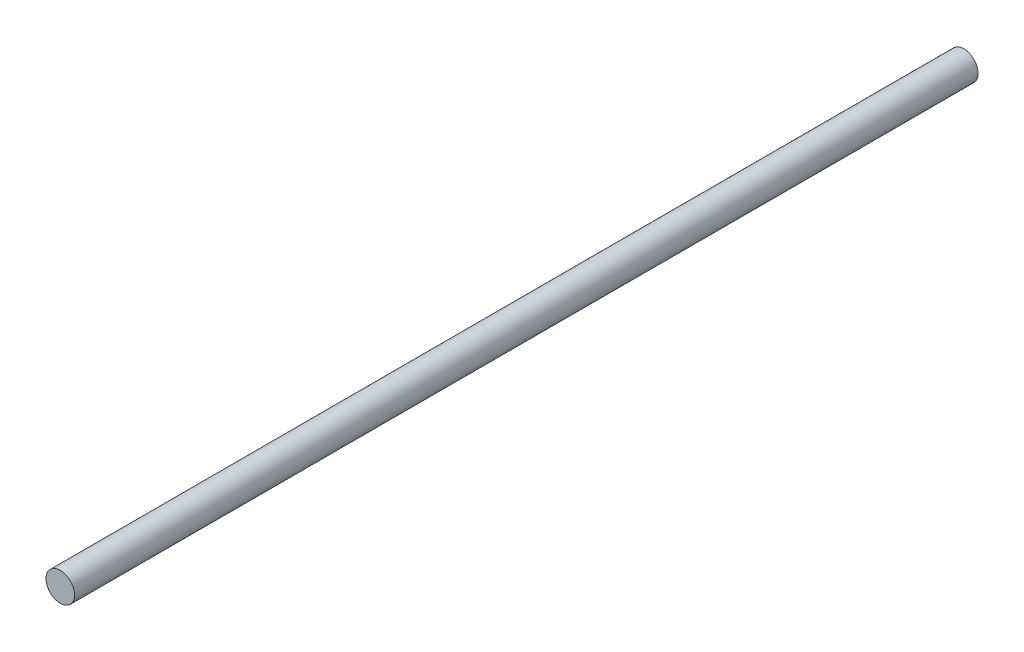
ISO-10303-21;
HEADER;
FILE_DESCRIPTION(('STEP AP214'),'2;1');
FILE_NAME('part.step','',(''),(''),'','','');
FILE_SCHEMA(('AUTOMOTIVE_DESIGN { 1 0 10303 214 1 1 1 1 }'));
ENDSEC;
DATA;
#1=APPLICATION_CONTEXT('core data for automotive mechanical design processes');
#2=APPLICATION_PROTOCOL_DEFINITION('international standard','automotive_design',2000,#1);
#3=PRODUCT_CONTEXT('',#1,'mechanical');
#4=PRODUCT('Part','Part','',(#3));
#5=PRODUCT_RELATED_PRODUCT_CATEGORY('part','',(#4));
#6=PRODUCT_DEFINITION_FORMATION('','',#4);
#7=PRODUCT_DEFINITION_CONTEXT('part definition',#1,'design');
#8=PRODUCT_DEFINITION('design','',#6,#7);
#9=PRODUCT_DEFINITION_SHAPE('','',#8);
#10=(LENGTH_UNIT() NAMED_UNIT(*) SI_UNIT(.MILLI.,.METRE.));
#11=(NAMED_UNIT(*) PLANE_ANGLE_UNIT() SI_UNIT($,.RADIAN.));
#12=(NAMED_UNIT(*) SI_UNIT($,.STERADIAN.) SOLID_ANGLE_UNIT());
#13=UNCERTAINTY_MEASURE_WITH_UNIT(LENGTH_MEASURE(1.E-05),#10,'distance_accuracy_value','');
#14=(GEOMETRIC_REPRESENTATION_CONTEXT(3) GLOBAL_UNCERTAINTY_ASSIGNED_CONTEXT((#13)) GLOBAL_UNIT_ASSIGNED_CONTEXT((#10,
#11,#12)) REPRESENTATION_CONTEXT('',''));
#15=CARTESIAN_POINT('',(0.,0.,0.));
#16=DIRECTION('',(0.,0.,1.));
#17=DIRECTION('',(1.,0.,0.));
#18=AXIS2_PLACEMENT_3D('',#15,#16,#17);
#19=CARTESIAN_POINT('',(0.,0.,241.3));
#20=DIRECTION('',(0.,0.,-1.));
#21=DIRECTION('',(-1.,0.,0.));
#22=AXIS2_PLACEMENT_3D('',#19,#20,#21);
#23=CYLINDRICAL_SURFACE('',#22,3.81);
#24=CARTESIAN_POINT('',(0.,0.,241.3));
#25=DIRECTION('',(0.,0.,1.));
#26=DIRECTION('',(1.,0.,0.));
#27=AXIS2_PLACEMENT_3D('',#24,#25,#26);
#28=CIRCLE('',#27,3.81);
#29=CARTESIAN_POINT('',(-3.81,0.,241.3));
#30=VERTEX_POINT('',#29);
#31=EDGE_CURVE('E10',#30,#30,#28,.T.);
#32=CARTESIAN_POINT('',(0.,0.,0.));
#33=DIRECTION('',(0.,0.,1.));
#34=DIRECTION('',(1.,0.,0.));
#35=AXIS2_PLACEMENT_3D('',#32,#33,#34);
#36=CIRCLE('',#35,3.81);
#37=CARTESIAN_POINT('',(-3.81,0.,0.));
#38=VERTEX_POINT('',#37);
#39=EDGE_CURVE('E48',#38,#38,#36,.T.);
#40=CARTESIAN_POINT('',(-3.81,0.,241.3));
#41=CARTESIAN_POINT('',(-3.81,0.,238.786458333333));
#42=CARTESIAN_POINT('',(-3.81,0.,236.272916666667));
#43=CARTESIAN_POINT('',(-3.81,0.,231.245833333333));
#44=CARTESIAN_POINT('',(-3.81,0.,228.732291666667));
#45=CARTESIAN_POINT('',(-3.81,0.,223.705208333333));
#46=CARTESIAN_POINT('',(-3.81,0.,221.191666666667));
#47=CARTESIAN_POINT('',(-3.81,0.,216.164583333333));
#48=CARTESIAN_POINT('',(-3.81,0.,213.651041666667));
#49=CARTESIAN_POINT('',(-3.81,0.,208.623958333333));
#50=CARTESIAN_POINT('',(-3.81,0.,206.110416666667));
#51=CARTESIAN_POINT('',(-3.81,0.,201.083333333333));
#52=CARTESIAN_POINT('',(-3.81,0.,198.569791666667));
#53=CARTESIAN_POINT('',(-3.81,0.,193.542708333333));
#54=CARTESIAN_POINT('',(-3.81,0.,191.029166666667));
#55=CARTESIAN_POINT('',(-3.81,0.,186.002083333333));
#56=CARTESIAN_POINT('',(-3.81,0.,183.488541666667));
#57=CARTESIAN_POINT('',(-3.81,0.,178.461458333333));
#58=CARTESIAN_POINT('',(-3.81,0.,175.947916666667));
#59=CARTESIAN_POINT('',(-3.81,0.,170.920833333333));
#60=CARTESIAN_POINT('',(-3.81,0.,168.407291666667));
#61=CARTESIAN_POINT('',(-3.81,0.,163.380208333333));
#62=CARTESIAN_POINT('',(-3.81,0.,160.866666666667));
#63=CARTESIAN_POINT('',(-3.81,0.,155.839583333333));
#64=CARTESIAN_POINT('',(-3.81,0.,153.326041666667));
#65=CARTESIAN_POINT('',(-3.81,0.,148.298958333333));
#66=CARTESIAN_POINT('',(-3.81,0.,145.785416666667));
#67=CARTESIAN_POINT('',(-3.81,0.,140.758333333333));
#68=CARTESIAN_POINT('',(-3.81,0.,138.244791666667));
#69=CARTESIAN_POINT('',(-3.81,0.,133.217708333333));
#70=CARTESIAN_POINT('',(-3.81,0.,130.704166666667));
#71=CARTESIAN_POINT('',(-3.81,0.,125.677083333333));
#72=CARTESIAN_POINT('',(-3.81,0.,123.163541666667));
#73=CARTESIAN_POINT('',(-3.81,0.,118.136458333333));
#74=CARTESIAN_POINT('',(-3.81,0.,115.622916666667));
#75=CARTESIAN_POINT('',(-3.81,0.,110.595833333333));
#76=CARTESIAN_POINT('',(-3.81,0.,108.082291666667));
#77=CARTESIAN_POINT('',(-3.81,0.,103.055208333333));
#78=CARTESIAN_POINT('',(-3.81,0.,100.541666666667));
#79=CARTESIAN_POINT('',(-3.81,0.,95.5145833333333));
#80=CARTESIAN_POINT('',(-3.81,0.,93.0010416666667));
#81=CARTESIAN_POINT('',(-3.81,0.,87.9739583333333));
#82=CARTESIAN_POINT('',(-3.81,0.,85.4604166666667));
#83=CARTESIAN_POINT('',(-3.81,0.,80.4333333333333));
#84=CARTESIAN_POINT('',(-3.81,0.,77.9197916666667));
#85=CARTESIAN_POINT('',(-3.81,0.,72.8927083333333));
#86=CARTESIAN_POINT('',(-3.81,0.,70.3791666666667));
#87=CARTESIAN_POINT('',(-3.81,0.,65.3520833333333));
#88=CARTESIAN_POINT('',(-3.81,0.,62.8385416666667));
#89=CARTESIAN_POINT('',(-3.81,0.,57.8114583333333));
#90=CARTESIAN_POINT('',(-3.81,0.,55.2979166666667));
#91=CARTESIAN_POINT('',(-3.81,0.,50.2708333333333));
#92=CARTESIAN_POINT('',(-3.81,0.,47.7572916666667));
#93=CARTESIAN_POINT('',(-3.81,0.,42.7302083333333));
#94=CARTESIAN_POINT('',(-3.81,0.,40.2166666666667));
#95=CARTESIAN_POINT('',(-3.81,0.,35.1895833333333));
#96=CARTESIAN_POINT('',(-3.81,0.,32.6760416666667));
#97=CARTESIAN_POINT('',(-3.81,0.,27.6489583333333));
#98=CARTESIAN_POINT('',(-3.81,0.,25.1354166666667));
#99=CARTESIAN_POINT('',(-3.81,0.,20.1083333333333));
#100=CARTESIAN_POINT('',(-3.81,0.,17.5947916666667));
#101=CARTESIAN_POINT('',(-3.81,0.,12.5677083333333));
#102=CARTESIAN_POINT('',(-3.81,0.,10.0541666666667));
#103=CARTESIAN_POINT('',(-3.81,0.,5.02708333333333));
#104=CARTESIAN_POINT('',(-3.81,0.,2.51354166666667));
#105=CARTESIAN_POINT('',(-3.81,0.,0.));
#106=B_SPLINE_CURVE_WITH_KNOTS('',3,(#40,#41,#42,#43,#44,#45,#46,#47,#48,#49,#50,#51,#52,#53,
#54,#55,#56,#57,#58,#59,#60,#61,#62,#63,#64,#65,#66,#67,#68,#69,#70,#71,#72,#73,#74,#75,#76,#77,
#78,#79,#80,#81,#82,#83,#84,#85,#86,#87,#88,#89,#90,#91,#92,#93,#94,#95,#96,#97,#98,#99,#100,
#101,#102,#103,#104,#105),.UNSPECIFIED.,.F.,.F.,(4,2,2,2,2,2,2,2,2,2,2,2,2,2,2,2,2,2,2,2,2,2,2,
2,2,2,2,2,2,2,2,2,4),(0.,7.540625,15.08125,22.621875,30.1625,37.703125,45.24375,52.784375,
60.325,67.865625,75.40625,82.946875,90.4875,98.028125,105.56875,113.109375,120.65,128.190625,
135.73125,143.271875,150.8125,158.353125,165.89375,173.434375,180.975,188.515625,196.05625,
203.596875,211.1375,218.678125,226.21875,233.759375,241.3),.UNSPECIFIED.);
#107=EDGE_CURVE('BSEAM45',#30,#38,#106,.T.);
#108=ORIENTED_EDGE('',*,*,#31,.F.);
#109=ORIENTED_EDGE('',*,*,#39,.T.);
#110=ORIENTED_EDGE('',*,*,#107,.T.);
#111=ORIENTED_EDGE('',*,*,#107,.F.);
#112=EDGE_LOOP('',(#108,#110,#109,#111));
#113=FACE_BOUND('',#112,.T.);
#114=ADVANCED_FACE('F45',(#113),#23,.T.);
#115=CARTESIAN_POINT('',(0.,0.,241.3));
#116=DIRECTION('',(0.,0.,1.));
#117=DIRECTION('',(1.,0.,0.));
#118=AXIS2_PLACEMENT_3D('',#115,#116,#117);
#119=PLANE('',#118);
#120=ORIENTED_EDGE('',*,*,#31,.T.);
#121=EDGE_LOOP('',(#120));
#122=FACE_BOUND('',#121,.T.);
#123=ADVANCED_FACE('F62',(#122),#119,.T.);
#124=CARTESIAN_POINT('',(0.,0.,0.));
#125=DIRECTION('',(0.,0.,1.));
#126=DIRECTION('',(1.,0.,0.));
#127=AXIS2_PLACEMENT_3D('',#124,#125,#126);
#128=PLANE('',#127);
#129=ORIENTED_EDGE('',*,*,#39,.F.);
#130=EDGE_LOOP('',(#129));
#131=FACE_BOUND('',#130,.T.);
#132=ADVANCED_FACE('F60',(#131),#128,.F.);
#133=CLOSED_SHELL('',(#114,#123,#132));
#134=MANIFOLD_SOLID_BREP('B2',#133);
#135=ADVANCED_BREP_SHAPE_REPRESENTATION('',(#18,#134),#14);
#136=SHAPE_DEFINITION_REPRESENTATION(#9,#135);
ENDSEC;
END-ISO-10303-21;
